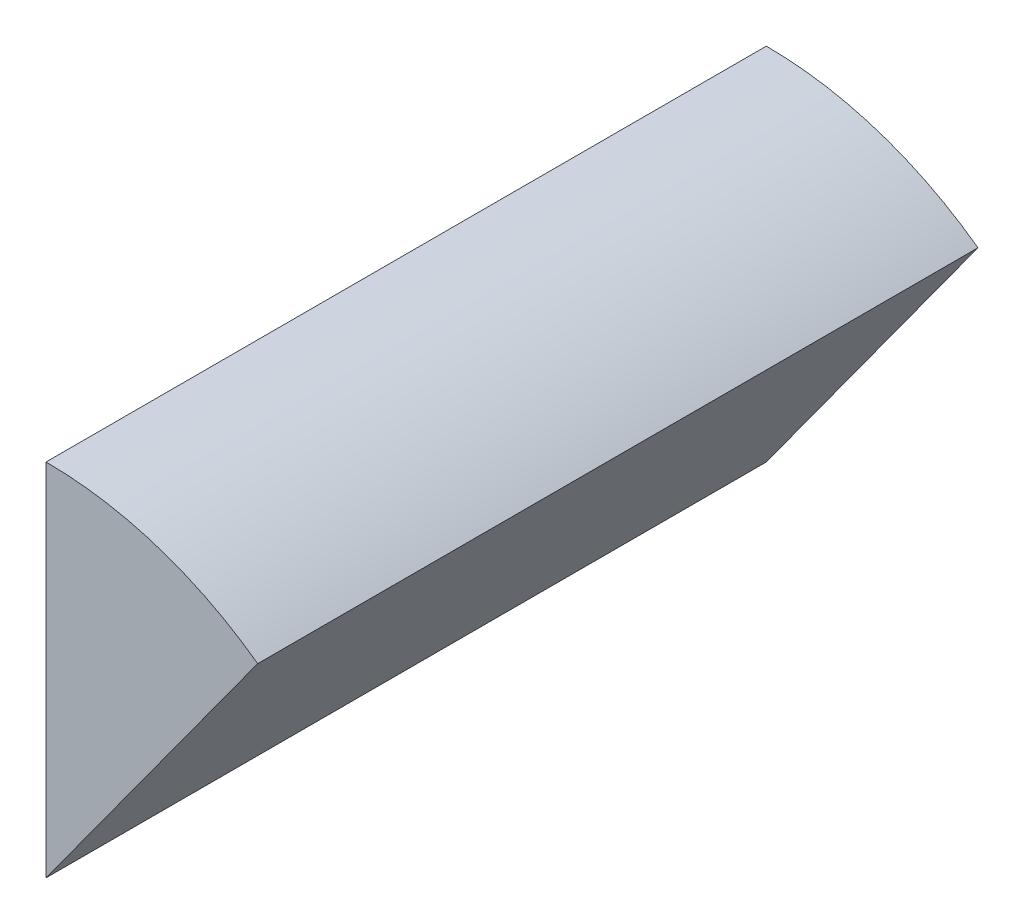
ISO-10303-21;
HEADER;
FILE_DESCRIPTION(('STEP AP214'),'2;1');
FILE_NAME('part.step','',(''),(''),'','','');
FILE_SCHEMA(('AUTOMOTIVE_DESIGN { 1 0 10303 214 1 1 1 1 }'));
ENDSEC;
DATA;
#1=APPLICATION_CONTEXT('core data for automotive mechanical design processes');
#2=APPLICATION_PROTOCOL_DEFINITION('international standard','automotive_design',2000,#1);
#3=PRODUCT_CONTEXT('',#1,'mechanical');
#4=PRODUCT('Part','Part','',(#3));
#5=PRODUCT_RELATED_PRODUCT_CATEGORY('part','',(#4));
#6=PRODUCT_DEFINITION_FORMATION('','',#4);
#7=PRODUCT_DEFINITION_CONTEXT('part definition',#1,'design');
#8=PRODUCT_DEFINITION('design','',#6,#7);
#9=PRODUCT_DEFINITION_SHAPE('','',#8);
#10=(LENGTH_UNIT() NAMED_UNIT(*) SI_UNIT(.MILLI.,.METRE.));
#11=(NAMED_UNIT(*) PLANE_ANGLE_UNIT() SI_UNIT($,.RADIAN.));
#12=(NAMED_UNIT(*) SI_UNIT($,.STERADIAN.) SOLID_ANGLE_UNIT());
#13=UNCERTAINTY_MEASURE_WITH_UNIT(LENGTH_MEASURE(1.E-05),#10,'distance_accuracy_value','');
#14=(GEOMETRIC_REPRESENTATION_CONTEXT(3) GLOBAL_UNCERTAINTY_ASSIGNED_CONTEXT((#13)) GLOBAL_UNIT_ASSIGNED_CONTEXT((#10,
#11,#12)) REPRESENTATION_CONTEXT('',''));
#15=CARTESIAN_POINT('',(0.,0.,0.));
#16=DIRECTION('',(0.,0.,1.));
#17=DIRECTION('',(1.,0.,0.));
#18=AXIS2_PLACEMENT_3D('',#15,#16,#17);
#19=CARTESIAN_POINT('',(0.,0.,50.));
#20=DIRECTION('',(-0.809016994374951,0.587785252292468,0.));
#21=DIRECTION('',(-0.587785252292468,-0.809016994374951,0.));
#22=AXIS2_PLACEMENT_3D('',#19,#20,#21);
#23=PLANE('',#22);
#24=DIRECTION('',(0.587785252292468,0.809016994374951,0.));
#25=VECTOR('',#24,1.);
#26=CARTESIAN_POINT('',(0.,0.,0.));
#27=LINE('',#26,#25);
#28=CARTESIAN_POINT('',(0.,0.,0.));
#29=VERTEX_POINT('',#28);
#30=CARTESIAN_POINT('',(14.6946313073117,20.2254248593738,0.));
#31=VERTEX_POINT('',#30);
#32=EDGE_CURVE('E80',#29,#31,#27,.T.);
#33=ORIENTED_EDGE('',*,*,#32,.T.);
#34=DIRECTION('',(0.,0.,-1.));
#35=VECTOR('',#34,1.);
#36=CARTESIAN_POINT('',(14.6946313073117,20.2254248593738,50.));
#37=LINE('',#36,#35);
#38=CARTESIAN_POINT('',(14.6946313073117,20.2254248593738,50.));
#39=VERTEX_POINT('',#38);
#40=EDGE_CURVE('E11',#39,#31,#37,.T.);
#41=ORIENTED_EDGE('',*,*,#40,.F.);
#42=DIRECTION('',(0.587785252292468,0.809016994374951,0.));
#43=VECTOR('',#42,1.);
#44=CARTESIAN_POINT('',(0.,0.,50.));
#45=LINE('',#44,#43);
#46=CARTESIAN_POINT('',(0.,0.,50.));
#47=VERTEX_POINT('',#46);
#48=EDGE_CURVE('E73',#47,#39,#45,.T.);
#49=ORIENTED_EDGE('',*,*,#48,.F.);
#50=DIRECTION('',(0.,0.,-1.));
#51=VECTOR('',#50,1.);
#52=CARTESIAN_POINT('',(0.,0.,50.));
#53=LINE('',#52,#51);
#54=EDGE_CURVE('E81',#47,#29,#53,.T.);
#55=ORIENTED_EDGE('',*,*,#54,.T.);
#56=EDGE_LOOP('',(#33,#41,#49,#55));
#57=FACE_BOUND('',#56,.T.);
#58=ADVANCED_FACE('F33',(#57),#23,.F.);
#59=CARTESIAN_POINT('',(0.,0.,50.));
#60=DIRECTION('',(0.,0.,-1.));
#61=DIRECTION('',(-1.,0.,0.));
#62=AXIS2_PLACEMENT_3D('',#59,#60,#61);
#63=CYLINDRICAL_SURFACE('',#62,25.);
#64=CARTESIAN_POINT('',(0.,0.,0.));
#65=DIRECTION('',(0.,0.,1.));
#66=DIRECTION('',(1.,0.,0.));
#67=AXIS2_PLACEMENT_3D('',#64,#65,#66);
#68=CIRCLE('',#67,25.);
#69=CARTESIAN_POINT('',(0.,25.,0.));
#70=VERTEX_POINT('',#69);
#71=EDGE_CURVE('E61',#31,#70,#68,.T.);
#72=ORIENTED_EDGE('',*,*,#71,.T.);
#73=DIRECTION('',(0.,0.,-1.));
#74=VECTOR('',#73,1.);
#75=CARTESIAN_POINT('',(0.,25.,50.));
#76=LINE('',#75,#74);
#77=CARTESIAN_POINT('',(0.,25.,50.));
#78=VERTEX_POINT('',#77);
#79=EDGE_CURVE('E41',#78,#70,#76,.T.);
#80=ORIENTED_EDGE('',*,*,#79,.F.);
#81=CARTESIAN_POINT('',(0.,0.,50.));
#82=DIRECTION('',(0.,0.,1.));
#83=DIRECTION('',(1.,0.,0.));
#84=AXIS2_PLACEMENT_3D('',#81,#82,#83);
#85=CIRCLE('',#84,25.);
#86=EDGE_CURVE('E69',#39,#78,#85,.T.);
#87=ORIENTED_EDGE('',*,*,#86,.F.);
#88=ORIENTED_EDGE('',*,*,#40,.T.);
#89=EDGE_LOOP('',(#72,#80,#87,#88));
#90=FACE_BOUND('',#89,.T.);
#91=ADVANCED_FACE('F70',(#90),#63,.T.);
#92=CARTESIAN_POINT('',(0.,25.,50.));
#93=DIRECTION('',(1.,0.,0.));
#94=DIRECTION('',(0.,0.,-1.));
#95=AXIS2_PLACEMENT_3D('',#92,#93,#94);
#96=PLANE('',#95);
#97=DIRECTION('',(0.,-1.,0.));
#98=VECTOR('',#97,1.);
#99=CARTESIAN_POINT('',(0.,25.,0.));
#100=LINE('',#99,#98);
#101=EDGE_CURVE('E66',#70,#29,#100,.T.);
#102=ORIENTED_EDGE('',*,*,#101,.T.);
#103=ORIENTED_EDGE('',*,*,#54,.F.);
#104=DIRECTION('',(0.,-1.,0.));
#105=VECTOR('',#104,1.);
#106=CARTESIAN_POINT('',(0.,25.,50.));
#107=LINE('',#106,#105);
#108=EDGE_CURVE('E49',#78,#47,#107,.T.);
#109=ORIENTED_EDGE('',*,*,#108,.F.);
#110=ORIENTED_EDGE('',*,*,#79,.T.);
#111=EDGE_LOOP('',(#102,#103,#109,#110));
#112=FACE_BOUND('',#111,.T.);
#113=ADVANCED_FACE('F92',(#112),#96,.F.);
#114=CARTESIAN_POINT('',(0.,0.,50.));
#115=DIRECTION('',(0.,0.,1.));
#116=DIRECTION('',(1.,0.,0.));
#117=AXIS2_PLACEMENT_3D('',#114,#115,#116);
#118=PLANE('',#117);
#119=ORIENTED_EDGE('',*,*,#48,.T.);
#120=ORIENTED_EDGE('',*,*,#86,.T.);
#121=ORIENTED_EDGE('',*,*,#108,.T.);
#122=EDGE_LOOP('',(#119,#120,#121));
#123=FACE_BOUND('',#122,.T.);
#124=ADVANCED_FACE('F76',(#123),#118,.T.);
#125=CARTESIAN_POINT('',(0.,0.,0.));
#126=DIRECTION('',(0.,0.,1.));
#127=DIRECTION('',(1.,0.,0.));
#128=AXIS2_PLACEMENT_3D('',#125,#126,#127);
#129=PLANE('',#128);
#130=CARTESIAN_POINT('',(5.74960950320044,18.3392355736884,0.));
#131=DIRECTION('',(0.,0.,-1.));
#132=DIRECTION('',(-1.,0.,0.));
#133=AXIS2_PLACEMENT_3D('',#130,#131,#132);
#134=CIRCLE('',#133,4.96368177912403);
#135=CARTESIAN_POINT('',(0.785927724076416,18.3392355736884,0.));
#136=VERTEX_POINT('',#135);
#137=EDGE_CURVE('E87',#136,#136,#134,.T.);
#138=ORIENTED_EDGE('',*,*,#137,.F.);
#139=EDGE_LOOP('',(#138));
#140=FACE_BOUND('',#139,.T.);
#141=ORIENTED_EDGE('',*,*,#32,.F.);
#142=ORIENTED_EDGE('',*,*,#101,.F.);
#143=ORIENTED_EDGE('',*,*,#71,.F.);
#144=EDGE_LOOP('',(#141,#142,#143));
#145=FACE_BOUND('',#144,.T.);
#146=ADVANCED_FACE('F93',(#140,#145),#129,.F.);
#147=CARTESIAN_POINT('',(5.74960950320044,18.3392355736884,10.));
#148=DIRECTION('',(0.,0.,-1.));
#149=DIRECTION('',(-1.,0.,0.));
#150=AXIS2_PLACEMENT_3D('',#147,#148,#149);
#151=CYLINDRICAL_SURFACE('',#150,4.96368177912403);
#152=CARTESIAN_POINT('',(5.74960950320044,18.3392355736884,10.));
#153=DIRECTION('',(0.,0.,-1.));
#154=DIRECTION('',(-1.,0.,0.));
#155=AXIS2_PLACEMENT_3D('',#152,#153,#154);
#156=CIRCLE('',#155,4.96368177912403);
#157=CARTESIAN_POINT('',(0.785927724076416,18.3392355736884,10.));
#158=VERTEX_POINT('',#157);
#159=EDGE_CURVE('E83',#158,#158,#156,.T.);
#160=ORIENTED_EDGE('',*,*,#159,.F.);
#161=EDGE_LOOP('',(#160));
#162=FACE_BOUND('',#161,.T.);
#163=ORIENTED_EDGE('',*,*,#137,.T.);
#164=EDGE_LOOP('',(#163));
#165=FACE_BOUND('',#164,.T.);
#166=ADVANCED_FACE('F95',(#162,#165),#151,.F.);
#167=CARTESIAN_POINT('',(5.74960950320044,18.3392355736884,10.));
#168=DIRECTION('',(0.,0.,-1.));
#169=DIRECTION('',(-1.,0.,0.));
#170=AXIS2_PLACEMENT_3D('',#167,#168,#169);
#171=PLANE('',#170);
#172=ORIENTED_EDGE('',*,*,#159,.T.);
#173=EDGE_LOOP('',(#172));
#174=FACE_BOUND('',#173,.T.);
#175=ADVANCED_FACE('F102',(#174),#171,.T.);
#176=CLOSED_SHELL('',(#58,#91,#113,#124,#146,#166,#175));
#177=MANIFOLD_SOLID_BREP('B2',#176);
#178=ADVANCED_BREP_SHAPE_REPRESENTATION('',(#18,#177),#14);
#179=SHAPE_DEFINITION_REPRESENTATION(#9,#178);
ENDSEC;
END-ISO-10303-21;
